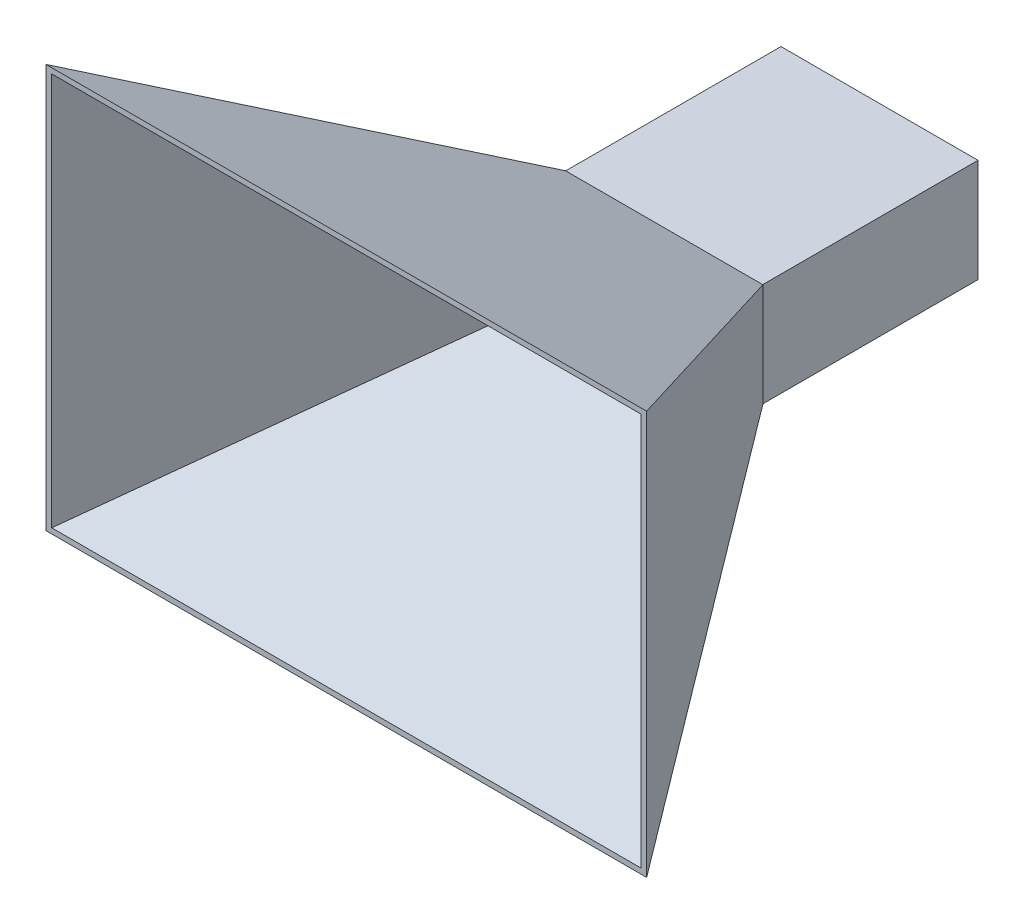
ISO-10303-21;
HEADER;
FILE_DESCRIPTION(('STEP AP214'),'2;1');
FILE_NAME('part.step','',(''),(''),'','','');
FILE_SCHEMA(('AUTOMOTIVE_DESIGN { 1 0 10303 214 1 1 1 1 }'));
ENDSEC;
DATA;
#1=APPLICATION_CONTEXT('core data for automotive mechanical design processes');
#2=APPLICATION_PROTOCOL_DEFINITION('international standard','automotive_design',2000,#1);
#3=PRODUCT_CONTEXT('',#1,'mechanical');
#4=PRODUCT('Part','Part','',(#3));
#5=PRODUCT_RELATED_PRODUCT_CATEGORY('part','',(#4));
#6=PRODUCT_DEFINITION_FORMATION('','',#4);
#7=PRODUCT_DEFINITION_CONTEXT('part definition',#1,'design');
#8=PRODUCT_DEFINITION('design','',#6,#7);
#9=PRODUCT_DEFINITION_SHAPE('','',#8);
#10=(LENGTH_UNIT() NAMED_UNIT(*) SI_UNIT(.MILLI.,.METRE.));
#11=(NAMED_UNIT(*) PLANE_ANGLE_UNIT() SI_UNIT($,.RADIAN.));
#12=(NAMED_UNIT(*) SI_UNIT($,.STERADIAN.) SOLID_ANGLE_UNIT());
#13=UNCERTAINTY_MEASURE_WITH_UNIT(LENGTH_MEASURE(1.E-05),#10,'distance_accuracy_value','');
#14=(GEOMETRIC_REPRESENTATION_CONTEXT(3) GLOBAL_UNCERTAINTY_ASSIGNED_CONTEXT((#13)) GLOBAL_UNIT_ASSIGNED_CONTEXT((#10,
#11,#12)) REPRESENTATION_CONTEXT('',''));
#15=CARTESIAN_POINT('',(0.,0.,0.));
#16=DIRECTION('',(0.,0.,1.));
#17=DIRECTION('',(1.,0.,0.));
#18=AXIS2_PLACEMENT_3D('',#15,#16,#17);
#19=CARTESIAN_POINT('',(20.4,9.7,-43.8));
#20=DIRECTION('',(1.,0.,0.));
#21=DIRECTION('',(0.,0.,-1.));
#22=AXIS2_PLACEMENT_3D('',#19,#20,#21);
#23=PLANE('',#22);
#24=DIRECTION('',(0.,1.,0.));
#25=VECTOR('',#24,1.);
#26=CARTESIAN_POINT('',(20.4,9.7,-0.290344014452056));
#27=LINE('',#26,#25);
#28=CARTESIAN_POINT('',(20.4,-10.7,-0.290344014452056));
#29=VERTEX_POINT('',#28);
#30=CARTESIAN_POINT('',(20.4,10.7,-0.290344014452056));
#31=VERTEX_POINT('',#30);
#32=EDGE_CURVE('E240',#29,#31,#27,.T.);
#33=ORIENTED_EDGE('',*,*,#32,.F.);
#34=DIRECTION('',(0.,0.,1.));
#35=VECTOR('',#34,1.);
#36=CARTESIAN_POINT('',(20.4,-10.7,-43.8));
#37=LINE('',#36,#35);
#38=CARTESIAN_POINT('',(20.4,-10.7,-44.8));
#39=VERTEX_POINT('',#38);
#40=EDGE_CURVE('E244',#39,#29,#37,.T.);
#41=ORIENTED_EDGE('',*,*,#40,.F.);
#42=DIRECTION('',(0.,1.,0.));
#43=VECTOR('',#42,1.);
#44=CARTESIAN_POINT('',(20.4,0.,-44.8));
#45=LINE('',#44,#43);
#46=CARTESIAN_POINT('',(20.4,10.7,-44.8));
#47=VERTEX_POINT('',#46);
#48=EDGE_CURVE('E248',#39,#47,#45,.T.);
#49=ORIENTED_EDGE('',*,*,#48,.T.);
#50=DIRECTION('',(0.,0.,1.));
#51=VECTOR('',#50,1.);
#52=CARTESIAN_POINT('',(20.4,10.7,-43.8));
#53=LINE('',#52,#51);
#54=EDGE_CURVE('E253',#47,#31,#53,.T.);
#55=ORIENTED_EDGE('',*,*,#54,.T.);
#56=EDGE_LOOP('',(#33,#41,#49,#55));
#57=FACE_BOUND('',#56,.T.);
#58=ADVANCED_FACE('F42',(#57),#23,.T.);
#59=CARTESIAN_POINT('',(-19.4,-10.7,-43.8));
#60=DIRECTION('',(0.,-1.,0.));
#61=DIRECTION('',(0.,0.,-1.));
#62=AXIS2_PLACEMENT_3D('',#59,#60,#61);
#63=PLANE('',#62);
#64=CARTESIAN_POINT('',(0.,-10.7,-33.4));
#65=DIRECTION('',(0.,-1.,0.));
#66=DIRECTION('',(0.,0.,-1.));
#67=AXIS2_PLACEMENT_3D('',#64,#65,#66);
#68=CIRCLE('',#67,2.);
#69=CARTESIAN_POINT('',(0.,-10.7,-35.4));
#70=VERTEX_POINT('',#69);
#71=EDGE_CURVE('E197',#70,#70,#68,.F.);
#72=ORIENTED_EDGE('',*,*,#71,.T.);
#73=EDGE_LOOP('',(#72));
#74=FACE_BOUND('',#73,.T.);
#75=DIRECTION('',(1.,0.,0.));
#76=VECTOR('',#75,1.);
#77=CARTESIAN_POINT('',(-19.4,-10.7,-0.224384176669715));
#78=LINE('',#77,#76);
#79=CARTESIAN_POINT('',(-20.4418281898132,-10.7,-0.224384176669715));
#80=VERTEX_POINT('',#79);
#81=CARTESIAN_POINT('',(20.4418281898132,-10.7,-0.224384176669723));
#82=VERTEX_POINT('',#81);
#83=EDGE_CURVE('E252',#80,#82,#78,.T.);
#84=ORIENTED_EDGE('',*,*,#83,.F.);
#85=DIRECTION('',(0.535542025358332,0.,-0.844508578449678));
#86=VECTOR('',#85,1.);
#87=CARTESIAN_POINT('',(-0.435089825797999,-10.7,-31.7734715968475));
#88=LINE('',#87,#86);
#89=CARTESIAN_POINT('',(-20.4,-10.7,-0.290344014452049));
#90=VERTEX_POINT('',#89);
#91=EDGE_CURVE('E52',#80,#90,#88,.T.);
#92=ORIENTED_EDGE('',*,*,#91,.T.);
#93=DIRECTION('',(0.,0.,1.));
#94=VECTOR('',#93,1.);
#95=CARTESIAN_POINT('',(-20.4,-10.7,-43.8));
#96=LINE('',#95,#94);
#97=CARTESIAN_POINT('',(-20.4,-10.7,-44.8));
#98=VERTEX_POINT('',#97);
#99=EDGE_CURVE('E247',#98,#90,#96,.T.);
#100=ORIENTED_EDGE('',*,*,#99,.F.);
#101=DIRECTION('',(1.,0.,0.));
#102=VECTOR('',#101,1.);
#103=CARTESIAN_POINT('',(0.,-10.7,-44.8));
#104=LINE('',#103,#102);
#105=EDGE_CURVE('E257',#98,#39,#104,.T.);
#106=ORIENTED_EDGE('',*,*,#105,.T.);
#107=ORIENTED_EDGE('',*,*,#40,.T.);
#108=DIRECTION('',(0.535542025358332,0.,0.844508578449678));
#109=VECTOR('',#108,1.);
#110=CARTESIAN_POINT('',(-10.6929542980883,-10.7,-49.3215411768221));
#111=LINE('',#110,#109);
#112=EDGE_CURVE('E12',#29,#82,#111,.T.);
#113=ORIENTED_EDGE('',*,*,#112,.T.);
#114=EDGE_LOOP('',(#84,#92,#100,#106,#107,#113));
#115=FACE_BOUND('',#114,.T.);
#116=ADVANCED_FACE('F290',(#74,#115),#63,.T.);
#117=CARTESIAN_POINT('',(-20.4,9.7,-43.8));
#118=DIRECTION('',(-1.,0.,0.));
#119=DIRECTION('',(0.,0.,1.));
#120=AXIS2_PLACEMENT_3D('',#117,#118,#119);
#121=PLANE('',#120);
#122=DIRECTION('',(0.,-1.,0.));
#123=VECTOR('',#122,1.);
#124=CARTESIAN_POINT('',(-20.4,9.7,-0.290344014452049));
#125=LINE('',#124,#123);
#126=CARTESIAN_POINT('',(-20.4,10.7,-0.290344014452049));
#127=VERTEX_POINT('',#126);
#128=EDGE_CURVE('E259',#127,#90,#125,.T.);
#129=ORIENTED_EDGE('',*,*,#128,.F.);
#130=DIRECTION('',(0.,0.,1.));
#131=VECTOR('',#130,1.);
#132=CARTESIAN_POINT('',(-20.4,10.7,-43.8));
#133=LINE('',#132,#131);
#134=CARTESIAN_POINT('',(-20.4,10.7,-44.8));
#135=VERTEX_POINT('',#134);
#136=EDGE_CURVE('E256',#135,#127,#133,.T.);
#137=ORIENTED_EDGE('',*,*,#136,.F.);
#138=DIRECTION('',(0.,-1.,0.));
#139=VECTOR('',#138,1.);
#140=CARTESIAN_POINT('',(-20.4,0.,-44.8));
#141=LINE('',#140,#139);
#142=EDGE_CURVE('E264',#135,#98,#141,.T.);
#143=ORIENTED_EDGE('',*,*,#142,.T.);
#144=ORIENTED_EDGE('',*,*,#99,.T.);
#145=EDGE_LOOP('',(#129,#137,#143,#144));
#146=FACE_BOUND('',#145,.T.);
#147=ADVANCED_FACE('F306',(#146),#121,.T.);
#148=CARTESIAN_POINT('',(-19.4,10.7,-43.8));
#149=DIRECTION('',(0.,1.,0.));
#150=DIRECTION('',(0.,0.,1.));
#151=AXIS2_PLACEMENT_3D('',#148,#149,#150);
#152=PLANE('',#151);
#153=DIRECTION('',(-1.,0.,0.));
#154=VECTOR('',#153,1.);
#155=CARTESIAN_POINT('',(-19.4,10.7,-0.224384176669729));
#156=LINE('',#155,#154);
#157=CARTESIAN_POINT('',(20.4418281898132,10.7,-0.224384176669729));
#158=VERTEX_POINT('',#157);
#159=CARTESIAN_POINT('',(-20.4418281898132,10.7,-0.224384176669727));
#160=VERTEX_POINT('',#159);
#161=EDGE_CURVE('E242',#158,#160,#156,.T.);
#162=ORIENTED_EDGE('',*,*,#161,.F.);
#163=DIRECTION('',(-0.535542025358332,0.,-0.844508578449678));
#164=VECTOR('',#163,1.);
#165=CARTESIAN_POINT('',(-10.6929542980883,10.7,-49.3215411768221));
#166=LINE('',#165,#164);
#167=EDGE_CURVE('E108',#158,#31,#166,.T.);
#168=ORIENTED_EDGE('',*,*,#167,.T.);
#169=ORIENTED_EDGE('',*,*,#54,.F.);
#170=DIRECTION('',(-1.,0.,0.));
#171=VECTOR('',#170,1.);
#172=CARTESIAN_POINT('',(0.,10.7,-44.8));
#173=LINE('',#172,#171);
#174=EDGE_CURVE('E251',#47,#135,#173,.T.);
#175=ORIENTED_EDGE('',*,*,#174,.T.);
#176=ORIENTED_EDGE('',*,*,#136,.T.);
#177=DIRECTION('',(-0.535542025358332,0.,0.844508578449678));
#178=VECTOR('',#177,1.);
#179=CARTESIAN_POINT('',(-0.435089825797999,10.7,-31.7734715968475));
#180=LINE('',#179,#178);
#181=EDGE_CURVE('E278',#127,#160,#180,.T.);
#182=ORIENTED_EDGE('',*,*,#181,.T.);
#183=EDGE_LOOP('',(#162,#168,#169,#175,#176,#182));
#184=FACE_BOUND('',#183,.T.);
#185=ADVANCED_FACE('F301',(#184),#152,.T.);
#186=CARTESIAN_POINT('',(0.,0.,-44.8));
#187=DIRECTION('',(0.,0.,1.));
#188=DIRECTION('',(1.,0.,0.));
#189=AXIS2_PLACEMENT_3D('',#186,#187,#188);
#190=PLANE('',#189);
#191=ORIENTED_EDGE('',*,*,#48,.F.);
#192=ORIENTED_EDGE('',*,*,#105,.F.);
#193=ORIENTED_EDGE('',*,*,#142,.F.);
#194=ORIENTED_EDGE('',*,*,#174,.F.);
#195=EDGE_LOOP('',(#191,#192,#193,#194));
#196=FACE_BOUND('',#195,.T.);
#197=ADVANCED_FACE('F153',(#196),#190,.F.);
#198=CARTESIAN_POINT('',(0.,0.,65.6));
#199=DIRECTION('',(0.,0.,1.));
#200=DIRECTION('',(1.,0.,0.));
#201=AXIS2_PLACEMENT_3D('',#198,#199,#200);
#202=PLANE('',#201);
#203=DIRECTION('',(0.,1.,0.));
#204=VECTOR('',#203,1.);
#205=CARTESIAN_POINT('',(61.,40.7,65.6));
#206=LINE('',#205,#204);
#207=CARTESIAN_POINT('',(61.,-40.7,65.6));
#208=VERTEX_POINT('',#207);
#209=CARTESIAN_POINT('',(61.,40.7,65.6));
#210=VERTEX_POINT('',#209);
#211=EDGE_CURVE('E187',#208,#210,#206,.T.);
#212=ORIENTED_EDGE('',*,*,#211,.F.);
#213=DIRECTION('',(1.,0.,0.));
#214=VECTOR('',#213,1.);
#215=CARTESIAN_POINT('',(-61.,-40.7,65.6));
#216=LINE('',#215,#214);
#217=CARTESIAN_POINT('',(-61.,-40.7,65.6));
#218=VERTEX_POINT('',#217);
#219=EDGE_CURVE('E138',#218,#208,#216,.T.);
#220=ORIENTED_EDGE('',*,*,#219,.F.);
#221=DIRECTION('',(0.,-1.,0.));
#222=VECTOR('',#221,1.);
#223=CARTESIAN_POINT('',(-61.,40.7,65.6));
#224=LINE('',#223,#222);
#225=CARTESIAN_POINT('',(-61.,40.7,65.6));
#226=VERTEX_POINT('',#225);
#227=EDGE_CURVE('E46',#226,#218,#224,.T.);
#228=ORIENTED_EDGE('',*,*,#227,.F.);
#229=DIRECTION('',(-1.,0.,0.));
#230=VECTOR('',#229,1.);
#231=CARTESIAN_POINT('',(-61.,40.7,65.6));
#232=LINE('',#231,#230);
#233=EDGE_CURVE('E177',#210,#226,#232,.T.);
#234=ORIENTED_EDGE('',*,*,#233,.F.);
#235=EDGE_LOOP('',(#212,#220,#228,#234));
#236=FACE_BOUND('',#235,.T.);
#237=DIRECTION('',(0.,1.,0.));
#238=VECTOR('',#237,1.);
#239=CARTESIAN_POINT('',(62.1841205945306,0.,65.6));
#240=LINE('',#239,#238);
#241=CARTESIAN_POINT('',(62.1841205945306,-41.8060352054384,65.6));
#242=VERTEX_POINT('',#241);
#243=CARTESIAN_POINT('',(62.1841205945306,41.8060352054385,65.6));
#244=VERTEX_POINT('',#243);
#245=EDGE_CURVE('E105',#242,#244,#240,.T.);
#246=ORIENTED_EDGE('',*,*,#245,.T.);
#247=DIRECTION('',(-1.,0.,0.));
#248=VECTOR('',#247,1.);
#249=CARTESIAN_POINT('',(0.,41.8060352054385,65.6));
#250=LINE('',#249,#248);
#251=CARTESIAN_POINT('',(-62.1841205945306,41.8060352054385,65.6));
#252=VERTEX_POINT('',#251);
#253=EDGE_CURVE('E113',#244,#252,#250,.T.);
#254=ORIENTED_EDGE('',*,*,#253,.T.);
#255=DIRECTION('',(0.,-1.,0.));
#256=VECTOR('',#255,1.);
#257=CARTESIAN_POINT('',(-62.1841205945306,0.,65.6));
#258=LINE('',#257,#256);
#259=CARTESIAN_POINT('',(-62.1841205945306,-41.8060352054384,65.6));
#260=VERTEX_POINT('',#259);
#261=EDGE_CURVE('E120',#252,#260,#258,.T.);
#262=ORIENTED_EDGE('',*,*,#261,.T.);
#263=DIRECTION('',(1.,0.,0.));
#264=VECTOR('',#263,1.);
#265=CARTESIAN_POINT('',(0.,-41.8060352054384,65.6));
#266=LINE('',#265,#264);
#267=EDGE_CURVE('E124',#260,#242,#266,.T.);
#268=ORIENTED_EDGE('',*,*,#267,.T.);
#269=EDGE_LOOP('',(#246,#254,#262,#268));
#270=FACE_BOUND('',#269,.T.);
#271=ADVANCED_FACE('F122',(#236,#270),#202,.T.);
#272=CARTESIAN_POINT('',(0.,8.83341178446678,-4.17432569083034));
#273=DIRECTION('',(0.,0.904130352345879,-0.427256721382961));
#274=DIRECTION('',(0.,0.427256721382961,0.904130352345879));
#275=AXIS2_PLACEMENT_3D('',#272,#273,#274);
#276=PLANE('',#275);
#277=DIRECTION('',(-0.49739561779261,-0.370655388258916,-0.784354628057577));
#278=VECTOR('',#277,1.);
#279=CARTESIAN_POINT('',(13.4993335294885,5.52650638293111,-11.172164217951));
#280=LINE('',#279,#278);
#281=EDGE_CURVE('E101',#244,#158,#280,.T.);
#282=ORIENTED_EDGE('',*,*,#281,.T.);
#283=ORIENTED_EDGE('',*,*,#161,.T.);
#284=DIRECTION('',(0.49739561779261,-0.370655388258916,-0.784354628057577));
#285=VECTOR('',#284,1.);
#286=CARTESIAN_POINT('',(-13.4993335294885,5.52650638293111,-11.172164217951));
#287=LINE('',#286,#285);
#288=EDGE_CURVE('E112',#252,#160,#287,.T.);
#289=ORIENTED_EDGE('',*,*,#288,.F.);
#290=ORIENTED_EDGE('',*,*,#253,.F.);
#291=EDGE_LOOP('',(#282,#283,#289,#290));
#292=FACE_BOUND('',#291,.T.);
#293=ADVANCED_FACE('F116',(#292),#276,.T.);
#294=CARTESIAN_POINT('',(-14.6804865165065,0.,-9.3095768153456));
#295=DIRECTION('',(-0.844508578449678,0.,-0.535542025358332));
#296=DIRECTION('',(-0.535542025358332,0.,0.844508578449678));
#297=AXIS2_PLACEMENT_3D('',#294,#295,#296);
#298=PLANE('',#297);
#299=ORIENTED_EDGE('',*,*,#288,.T.);
#300=ORIENTED_EDGE('',*,*,#181,.F.);
#301=ORIENTED_EDGE('',*,*,#128,.T.);
#302=ORIENTED_EDGE('',*,*,#91,.F.);
#303=DIRECTION('',(0.49739561779261,0.370655388258916,-0.784354628057577));
#304=VECTOR('',#303,1.);
#305=CARTESIAN_POINT('',(-13.4993335294885,-5.52650638293111,-11.172164217951));
#306=LINE('',#305,#304);
#307=EDGE_CURVE('E243',#260,#80,#306,.T.);
#308=ORIENTED_EDGE('',*,*,#307,.F.);
#309=ORIENTED_EDGE('',*,*,#261,.F.);
#310=EDGE_LOOP('',(#299,#300,#301,#302,#308,#309));
#311=FACE_BOUND('',#310,.T.);
#312=ADVANCED_FACE('F285',(#311),#298,.T.);
#313=CARTESIAN_POINT('',(14.6804865165065,0.,-9.30957681534561));
#314=DIRECTION('',(0.844508578449678,0.,-0.535542025358332));
#315=DIRECTION('',(-0.535542025358332,0.,-0.844508578449678));
#316=AXIS2_PLACEMENT_3D('',#313,#314,#315);
#317=PLANE('',#316);
#318=DIRECTION('',(-0.49739561779261,0.370655388258916,-0.784354628057577));
#319=VECTOR('',#318,1.);
#320=CARTESIAN_POINT('',(13.4993335294885,-5.52650638293111,-11.172164217951));
#321=LINE('',#320,#319);
#322=EDGE_CURVE('E69',#242,#82,#321,.T.);
#323=ORIENTED_EDGE('',*,*,#322,.T.);
#324=ORIENTED_EDGE('',*,*,#112,.F.);
#325=ORIENTED_EDGE('',*,*,#32,.T.);
#326=ORIENTED_EDGE('',*,*,#167,.F.);
#327=ORIENTED_EDGE('',*,*,#281,.F.);
#328=ORIENTED_EDGE('',*,*,#245,.F.);
#329=EDGE_LOOP('',(#323,#324,#325,#326,#327,#328));
#330=FACE_BOUND('',#329,.T.);
#331=ADVANCED_FACE('F103',(#330),#317,.T.);
#332=CARTESIAN_POINT('',(0.,-8.83341178446678,-4.17432569083034));
#333=DIRECTION('',(0.,-0.904130352345879,-0.427256721382961));
#334=DIRECTION('',(0.,0.427256721382961,-0.904130352345879));
#335=AXIS2_PLACEMENT_3D('',#332,#333,#334);
#336=PLANE('',#335);
#337=ORIENTED_EDGE('',*,*,#307,.T.);
#338=ORIENTED_EDGE('',*,*,#83,.T.);
#339=ORIENTED_EDGE('',*,*,#322,.F.);
#340=ORIENTED_EDGE('',*,*,#267,.F.);
#341=EDGE_LOOP('',(#337,#338,#339,#340));
#342=FACE_BOUND('',#341,.T.);
#343=ADVANCED_FACE('F44',(#342),#336,.T.);
#344=CARTESIAN_POINT('',(19.4,9.7,-43.8));
#345=DIRECTION('',(1.,0.,0.));
#346=DIRECTION('',(0.,0.,-1.));
#347=AXIS2_PLACEMENT_3D('',#344,#345,#346);
#348=PLANE('',#347);
#349=DIRECTION('',(0.,1.,0.));
#350=VECTOR('',#349,1.);
#351=CARTESIAN_POINT('',(19.4,0.,0.));
#352=LINE('',#351,#350);
#353=CARTESIAN_POINT('',(19.4,-9.7,0.));
#354=VERTEX_POINT('',#353);
#355=CARTESIAN_POINT('',(19.4,9.7,0.));
#356=VERTEX_POINT('',#355);
#357=EDGE_CURVE('E229',#354,#356,#352,.T.);
#358=ORIENTED_EDGE('',*,*,#357,.T.);
#359=DIRECTION('',(0.,0.,1.));
#360=VECTOR('',#359,1.);
#361=CARTESIAN_POINT('',(19.4,9.7,-43.8));
#362=LINE('',#361,#360);
#363=CARTESIAN_POINT('',(19.4,9.7,-43.8));
#364=VERTEX_POINT('',#363);
#365=EDGE_CURVE('E220',#364,#356,#362,.T.);
#366=ORIENTED_EDGE('',*,*,#365,.F.);
#367=DIRECTION('',(0.,1.,0.));
#368=VECTOR('',#367,1.);
#369=CARTESIAN_POINT('',(19.4,9.7,-43.8));
#370=LINE('',#369,#368);
#371=CARTESIAN_POINT('',(19.4,-9.7,-43.8));
#372=VERTEX_POINT('',#371);
#373=EDGE_CURVE('E208',#372,#364,#370,.T.);
#374=ORIENTED_EDGE('',*,*,#373,.F.);
#375=DIRECTION('',(0.,0.,1.));
#376=VECTOR('',#375,1.);
#377=CARTESIAN_POINT('',(19.4,-9.7,-43.8));
#378=LINE('',#377,#376);
#379=EDGE_CURVE('E125',#372,#354,#378,.T.);
#380=ORIENTED_EDGE('',*,*,#379,.T.);
#381=EDGE_LOOP('',(#358,#366,#374,#380));
#382=FACE_BOUND('',#381,.T.);
#383=ADVANCED_FACE('F154',(#382),#348,.F.);
#384=CARTESIAN_POINT('',(-19.4,-9.7,-43.8));
#385=DIRECTION('',(0.,-1.,0.));
#386=DIRECTION('',(0.,0.,-1.));
#387=AXIS2_PLACEMENT_3D('',#384,#385,#386);
#388=PLANE('',#387);
#389=CARTESIAN_POINT('',(0.,-9.7,-33.4));
#390=DIRECTION('',(0.,1.,0.));
#391=DIRECTION('',(0.,0.,1.));
#392=AXIS2_PLACEMENT_3D('',#389,#390,#391);
#393=CIRCLE('',#392,2.);
#394=CARTESIAN_POINT('',(0.,-9.7,-31.4));
#395=VERTEX_POINT('',#394);
#396=EDGE_CURVE('E194',#395,#395,#393,.T.);
#397=ORIENTED_EDGE('',*,*,#396,.F.);
#398=EDGE_LOOP('',(#397));
#399=FACE_BOUND('',#398,.T.);
#400=DIRECTION('',(1.,0.,0.));
#401=VECTOR('',#400,1.);
#402=CARTESIAN_POINT('',(0.,-9.7,0.));
#403=LINE('',#402,#401);
#404=CARTESIAN_POINT('',(-19.4,-9.7,0.));
#405=VERTEX_POINT('',#404);
#406=EDGE_CURVE('E212',#405,#354,#403,.T.);
#407=ORIENTED_EDGE('',*,*,#406,.T.);
#408=ORIENTED_EDGE('',*,*,#379,.F.);
#409=DIRECTION('',(1.,0.,0.));
#410=VECTOR('',#409,1.);
#411=CARTESIAN_POINT('',(-19.4,-9.7,-43.8));
#412=LINE('',#411,#410);
#413=CARTESIAN_POINT('',(-19.4,-9.7,-43.8));
#414=VERTEX_POINT('',#413);
#415=EDGE_CURVE('E218',#414,#372,#412,.T.);
#416=ORIENTED_EDGE('',*,*,#415,.F.);
#417=DIRECTION('',(0.,0.,1.));
#418=VECTOR('',#417,1.);
#419=CARTESIAN_POINT('',(-19.4,-9.7,-43.8));
#420=LINE('',#419,#418);
#421=EDGE_CURVE('E129',#414,#405,#420,.T.);
#422=ORIENTED_EDGE('',*,*,#421,.T.);
#423=EDGE_LOOP('',(#407,#408,#416,#422));
#424=FACE_BOUND('',#423,.T.);
#425=ADVANCED_FACE('F406',(#399,#424),#388,.F.);
#426=CARTESIAN_POINT('',(-19.4,9.7,-43.8));
#427=DIRECTION('',(-1.,0.,0.));
#428=DIRECTION('',(0.,0.,1.));
#429=AXIS2_PLACEMENT_3D('',#426,#427,#428);
#430=PLANE('',#429);
#431=DIRECTION('',(0.,1.,0.));
#432=VECTOR('',#431,1.);
#433=CARTESIAN_POINT('',(-19.4,0.,0.));
#434=LINE('',#433,#432);
#435=CARTESIAN_POINT('',(-19.4,9.7,0.));
#436=VERTEX_POINT('',#435);
#437=EDGE_CURVE('E235',#436,#405,#434,.F.);
#438=ORIENTED_EDGE('',*,*,#437,.T.);
#439=ORIENTED_EDGE('',*,*,#421,.F.);
#440=DIRECTION('',(0.,-1.,0.));
#441=VECTOR('',#440,1.);
#442=CARTESIAN_POINT('',(-19.4,9.7,-43.8));
#443=LINE('',#442,#441);
#444=CARTESIAN_POINT('',(-19.4,9.7,-43.8));
#445=VERTEX_POINT('',#444);
#446=EDGE_CURVE('E215',#445,#414,#443,.T.);
#447=ORIENTED_EDGE('',*,*,#446,.F.);
#448=DIRECTION('',(0.,0.,1.));
#449=VECTOR('',#448,1.);
#450=CARTESIAN_POINT('',(-19.4,9.7,-43.8));
#451=LINE('',#450,#449);
#452=EDGE_CURVE('E224',#445,#436,#451,.T.);
#453=ORIENTED_EDGE('',*,*,#452,.T.);
#454=EDGE_LOOP('',(#438,#439,#447,#453));
#455=FACE_BOUND('',#454,.T.);
#456=ADVANCED_FACE('F408',(#455),#430,.F.);
#457=CARTESIAN_POINT('',(-19.4,9.7,-43.8));
#458=DIRECTION('',(0.,1.,0.));
#459=DIRECTION('',(0.,0.,1.));
#460=AXIS2_PLACEMENT_3D('',#457,#458,#459);
#461=PLANE('',#460);
#462=DIRECTION('',(1.,0.,0.));
#463=VECTOR('',#462,1.);
#464=CARTESIAN_POINT('',(0.,9.7,0.));
#465=LINE('',#464,#463);
#466=EDGE_CURVE('E232',#356,#436,#465,.F.);
#467=ORIENTED_EDGE('',*,*,#466,.T.);
#468=ORIENTED_EDGE('',*,*,#452,.F.);
#469=DIRECTION('',(-1.,0.,0.));
#470=VECTOR('',#469,1.);
#471=CARTESIAN_POINT('',(-19.4,9.7,-43.8));
#472=LINE('',#471,#470);
#473=EDGE_CURVE('E211',#364,#445,#472,.T.);
#474=ORIENTED_EDGE('',*,*,#473,.F.);
#475=ORIENTED_EDGE('',*,*,#365,.T.);
#476=EDGE_LOOP('',(#467,#468,#474,#475));
#477=FACE_BOUND('',#476,.T.);
#478=ADVANCED_FACE('F412',(#477),#461,.F.);
#479=CARTESIAN_POINT('',(0.,0.,-43.8));
#480=DIRECTION('',(0.,0.,1.));
#481=DIRECTION('',(1.,0.,0.));
#482=AXIS2_PLACEMENT_3D('',#479,#480,#481);
#483=PLANE('',#482);
#484=ORIENTED_EDGE('',*,*,#373,.T.);
#485=ORIENTED_EDGE('',*,*,#473,.T.);
#486=ORIENTED_EDGE('',*,*,#446,.T.);
#487=ORIENTED_EDGE('',*,*,#415,.T.);
#488=EDGE_LOOP('',(#484,#485,#486,#487));
#489=FACE_BOUND('',#488,.T.);
#490=ADVANCED_FACE('F380',(#489),#483,.T.);
#491=CARTESIAN_POINT('',(0.,7.9292814321209,-3.74706896944738));
#492=DIRECTION('',(0.,0.904130352345879,-0.427256721382961));
#493=DIRECTION('',(0.,0.427256721382961,0.904130352345879));
#494=AXIS2_PLACEMENT_3D('',#491,#492,#493);
#495=PLANE('',#494);
#496=DIRECTION('',(-0.49739561779261,-0.370655388258916,-0.784354628057577));
#497=VECTOR('',#496,1.);
#498=CARTESIAN_POINT('',(61.,40.7,65.6));
#499=LINE('',#498,#497);
#500=EDGE_CURVE('E342',#210,#356,#499,.T.);
#501=ORIENTED_EDGE('',*,*,#500,.F.);
#502=ORIENTED_EDGE('',*,*,#233,.T.);
#503=DIRECTION('',(0.49739561779261,-0.370655388258916,-0.784354628057577));
#504=VECTOR('',#503,1.);
#505=CARTESIAN_POINT('',(-61.,40.7,65.6));
#506=LINE('',#505,#504);
#507=EDGE_CURVE('E341',#226,#436,#506,.T.);
#508=ORIENTED_EDGE('',*,*,#507,.T.);
#509=ORIENTED_EDGE('',*,*,#466,.F.);
#510=EDGE_LOOP('',(#501,#502,#508,#509));
#511=FACE_BOUND('',#510,.T.);
#512=ADVANCED_FACE('F339',(#511),#495,.F.);
#513=CARTESIAN_POINT('',(-13.8359779380568,0.,-8.77403478998727));
#514=DIRECTION('',(-0.844508578449678,0.,-0.535542025358332));
#515=DIRECTION('',(-0.535542025358332,0.,0.844508578449678));
#516=AXIS2_PLACEMENT_3D('',#513,#514,#515);
#517=PLANE('',#516);
#518=ORIENTED_EDGE('',*,*,#507,.F.);
#519=ORIENTED_EDGE('',*,*,#227,.T.);
#520=DIRECTION('',(0.49739561779261,0.370655388258916,-0.784354628057577));
#521=VECTOR('',#520,1.);
#522=CARTESIAN_POINT('',(-61.,-40.7,65.6));
#523=LINE('',#522,#521);
#524=EDGE_CURVE('E60',#218,#405,#523,.T.);
#525=ORIENTED_EDGE('',*,*,#524,.T.);
#526=ORIENTED_EDGE('',*,*,#437,.F.);
#527=EDGE_LOOP('',(#518,#519,#525,#526));
#528=FACE_BOUND('',#527,.T.);
#529=ADVANCED_FACE('F347',(#528),#517,.F.);
#530=CARTESIAN_POINT('',(13.8359779380568,0.,-8.77403478998727));
#531=DIRECTION('',(0.844508578449678,0.,-0.535542025358332));
#532=DIRECTION('',(-0.535542025358332,0.,-0.844508578449678));
#533=AXIS2_PLACEMENT_3D('',#530,#531,#532);
#534=PLANE('',#533);
#535=DIRECTION('',(-0.49739561779261,0.370655388258916,-0.784354628057577));
#536=VECTOR('',#535,1.);
#537=CARTESIAN_POINT('',(61.,-40.7,65.6));
#538=LINE('',#537,#536);
#539=EDGE_CURVE('E349',#208,#354,#538,.T.);
#540=ORIENTED_EDGE('',*,*,#539,.F.);
#541=ORIENTED_EDGE('',*,*,#211,.T.);
#542=ORIENTED_EDGE('',*,*,#500,.T.);
#543=ORIENTED_EDGE('',*,*,#357,.F.);
#544=EDGE_LOOP('',(#540,#541,#542,#543));
#545=FACE_BOUND('',#544,.T.);
#546=ADVANCED_FACE('F363',(#545),#534,.F.);
#547=CARTESIAN_POINT('',(0.,-7.9292814321209,-3.74706896944738));
#548=DIRECTION('',(0.,-0.904130352345879,-0.427256721382961));
#549=DIRECTION('',(0.,0.427256721382961,-0.904130352345879));
#550=AXIS2_PLACEMENT_3D('',#547,#548,#549);
#551=PLANE('',#550);
#552=ORIENTED_EDGE('',*,*,#524,.F.);
#553=ORIENTED_EDGE('',*,*,#219,.T.);
#554=ORIENTED_EDGE('',*,*,#539,.T.);
#555=ORIENTED_EDGE('',*,*,#406,.F.);
#556=EDGE_LOOP('',(#552,#553,#554,#555));
#557=FACE_BOUND('',#556,.T.);
#558=ADVANCED_FACE('F373',(#557),#551,.F.);
#559=CARTESIAN_POINT('',(0.,-41.8070352054384,-33.4));
#560=DIRECTION('',(0.,1.,0.));
#561=DIRECTION('',(0.,0.,1.));
#562=AXIS2_PLACEMENT_3D('',#559,#560,#561);
#563=CYLINDRICAL_SURFACE('',#562,2.);
#564=ORIENTED_EDGE('',*,*,#71,.F.);
#565=EDGE_LOOP('',(#564));
#566=FACE_BOUND('',#565,.T.);
#567=ORIENTED_EDGE('',*,*,#396,.T.);
#568=EDGE_LOOP('',(#567));
#569=FACE_BOUND('',#568,.T.);
#570=ADVANCED_FACE('F379',(#566,#569),#563,.F.);
#571=CLOSED_SHELL('',(#58,#116,#147,#185,#197,#271,#293,#312,#331,#343,#383,#425,#456,#478,#490,
#512,#529,#546,#558,#570));
#572=MANIFOLD_SOLID_BREP('B2',#571);
#573=ADVANCED_BREP_SHAPE_REPRESENTATION('',(#18,#572),#14);
#574=SHAPE_DEFINITION_REPRESENTATION(#9,#573);
ENDSEC;
END-ISO-10303-21;
